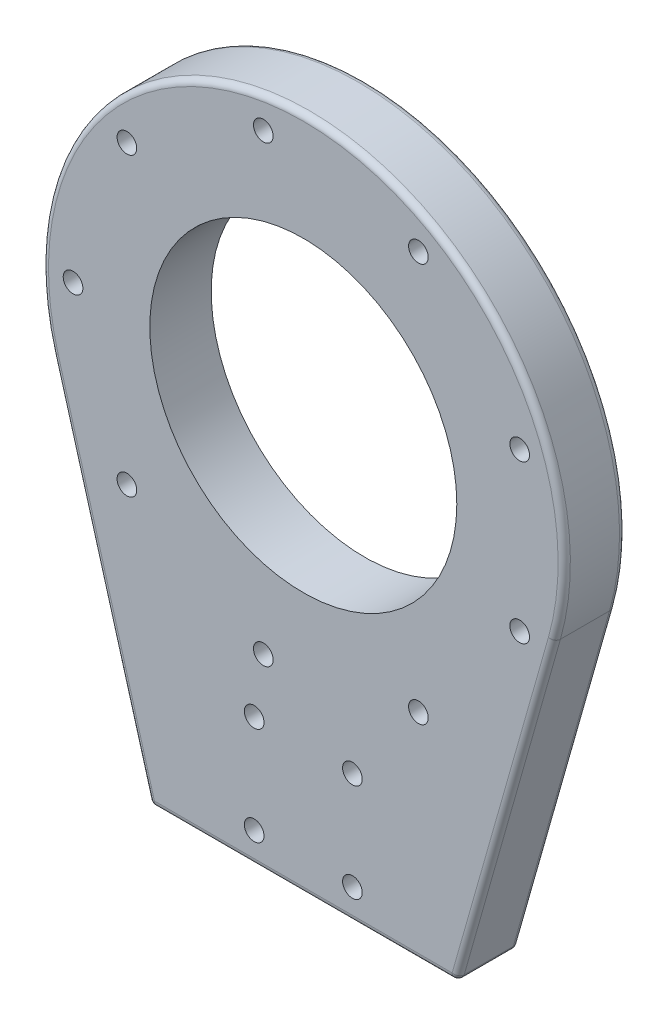
ISO-10303-21;
HEADER;
FILE_DESCRIPTION(('STEP AP214'),'2;1');
FILE_NAME('part.step','',(''),(''),'','','');
FILE_SCHEMA(('AUTOMOTIVE_DESIGN { 1 0 10303 214 1 1 1 1 }'));
ENDSEC;
DATA;
#1=APPLICATION_CONTEXT('core data for automotive mechanical design processes');
#2=APPLICATION_PROTOCOL_DEFINITION('international standard','automotive_design',2000,#1);
#3=PRODUCT_CONTEXT('',#1,'mechanical');
#4=PRODUCT('Part','Part','',(#3));
#5=PRODUCT_RELATED_PRODUCT_CATEGORY('part','',(#4));
#6=PRODUCT_DEFINITION_FORMATION('','',#4);
#7=PRODUCT_DEFINITION_CONTEXT('part definition',#1,'design');
#8=PRODUCT_DEFINITION('design','',#6,#7);
#9=PRODUCT_DEFINITION_SHAPE('','',#8);
#10=(LENGTH_UNIT() NAMED_UNIT(*) SI_UNIT(.MILLI.,.METRE.));
#11=(NAMED_UNIT(*) PLANE_ANGLE_UNIT() SI_UNIT($,.RADIAN.));
#12=(NAMED_UNIT(*) SI_UNIT($,.STERADIAN.) SOLID_ANGLE_UNIT());
#13=UNCERTAINTY_MEASURE_WITH_UNIT(LENGTH_MEASURE(1.E-05),#10,'distance_accuracy_value','');
#14=(GEOMETRIC_REPRESENTATION_CONTEXT(3) GLOBAL_UNCERTAINTY_ASSIGNED_CONTEXT((#13)) GLOBAL_UNIT_ASSIGNED_CONTEXT((#10,
#11,#12)) REPRESENTATION_CONTEXT('',''));
#15=CARTESIAN_POINT('',(0.,0.,0.));
#16=DIRECTION('',(0.,0.,1.));
#17=DIRECTION('',(1.,0.,0.));
#18=AXIS2_PLACEMENT_3D('',#15,#16,#17);
#19=CARTESIAN_POINT('',(0.,0.,10.));
#20=DIRECTION('',(0.,0.,1.));
#21=DIRECTION('',(1.,0.,0.));
#22=AXIS2_PLACEMENT_3D('',#19,#20,#21);
#23=PLANE('',#22);
#24=CARTESIAN_POINT('',(-8.,-46.5,10.));
#25=DIRECTION('',(0.,0.,1.));
#26=DIRECTION('',(1.,0.,0.));
#27=AXIS2_PLACEMENT_3D('',#24,#25,#26);
#28=CIRCLE('',#27,1.6);
#29=CARTESIAN_POINT('',(-6.4,-46.5,10.));
#30=VERTEX_POINT('',#29);
#31=EDGE_CURVE('E663',#30,#30,#28,.T.);
#32=ORIENTED_EDGE('',*,*,#31,.F.);
#33=EDGE_LOOP('',(#32));
#34=FACE_BOUND('',#33,.T.);
#35=CARTESIAN_POINT('',(8.,-62.5,10.));
#36=DIRECTION('',(0.,0.,1.));
#37=DIRECTION('',(1.,0.,0.));
#38=AXIS2_PLACEMENT_3D('',#35,#36,#37);
#39=CIRCLE('',#38,1.6);
#40=CARTESIAN_POINT('',(9.6,-62.5,10.));
#41=VERTEX_POINT('',#40);
#42=EDGE_CURVE('E671',#41,#41,#39,.T.);
#43=ORIENTED_EDGE('',*,*,#42,.F.);
#44=EDGE_LOOP('',(#43));
#45=FACE_BOUND('',#44,.T.);
#46=CARTESIAN_POINT('',(-8.,-62.5,10.));
#47=DIRECTION('',(0.,0.,1.));
#48=DIRECTION('',(1.,0.,0.));
#49=AXIS2_PLACEMENT_3D('',#46,#47,#48);
#50=CIRCLE('',#49,1.6);
#51=CARTESIAN_POINT('',(-6.4,-62.5,10.));
#52=VERTEX_POINT('',#51);
#53=EDGE_CURVE('E672',#52,#52,#50,.T.);
#54=ORIENTED_EDGE('',*,*,#53,.F.);
#55=EDGE_LOOP('',(#54));
#56=FACE_BOUND('',#55,.T.);
#57=CARTESIAN_POINT('',(8.,-46.5,10.));
#58=DIRECTION('',(0.,0.,1.));
#59=DIRECTION('',(1.,0.,0.));
#60=AXIS2_PLACEMENT_3D('',#57,#58,#59);
#61=CIRCLE('',#60,1.6);
#62=CARTESIAN_POINT('',(9.6,-46.5,10.));
#63=VERTEX_POINT('',#62);
#64=EDGE_CURVE('E659',#63,#63,#61,.T.);
#65=ORIENTED_EDGE('',*,*,#64,.F.);
#66=EDGE_LOOP('',(#65));
#67=FACE_BOUND('',#66,.T.);
#68=CARTESIAN_POINT('',(-6.51180666250987,-36.9302907379578,10.));
#69=DIRECTION('',(0.,0.,1.));
#70=DIRECTION('',(1.,0.,0.));
#71=AXIS2_PLACEMENT_3D('',#68,#69,#70);
#72=CIRCLE('',#71,1.6);
#73=CARTESIAN_POINT('',(-4.91180666250987,-36.9302907379578,10.));
#74=VERTEX_POINT('',#73);
#75=EDGE_CURVE('E567',#74,#74,#72,.T.);
#76=ORIENTED_EDGE('',*,*,#75,.F.);
#77=EDGE_LOOP('',(#76));
#78=FACE_BOUND('',#77,.T.);
#79=CARTESIAN_POINT('',(35.2384732794716,-12.8257553747126,10.));
#80=DIRECTION('',(0.,0.,1.));
#81=DIRECTION('',(1.,0.,0.));
#82=AXIS2_PLACEMENT_3D('',#79,#80,#81);
#83=CIRCLE('',#82,1.6);
#84=CARTESIAN_POINT('',(36.8384732794716,-12.8257553747126,10.));
#85=VERTEX_POINT('',#84);
#86=EDGE_CURVE('E583',#85,#85,#83,.T.);
#87=ORIENTED_EDGE('',*,*,#86,.F.);
#88=EDGE_LOOP('',(#87));
#89=FACE_BOUND('',#88,.T.);
#90=CARTESIAN_POINT('',(18.75,32.4759526419165,10.));
#91=DIRECTION('',(0.,0.,1.));
#92=DIRECTION('',(1.,0.,0.));
#93=AXIS2_PLACEMENT_3D('',#90,#91,#92);
#94=CIRCLE('',#93,1.6);
#95=CARTESIAN_POINT('',(20.35,32.4759526419165,10.));
#96=VERTEX_POINT('',#95);
#97=EDGE_CURVE('E599',#96,#96,#94,.T.);
#98=ORIENTED_EDGE('',*,*,#97,.F.);
#99=EDGE_LOOP('',(#98));
#100=FACE_BOUND('',#99,.T.);
#101=CARTESIAN_POINT('',(-28.7266666169617,24.1045353632452,10.));
#102=DIRECTION('',(0.,0.,1.));
#103=DIRECTION('',(1.,0.,0.));
#104=AXIS2_PLACEMENT_3D('',#101,#102,#103);
#105=CIRCLE('',#104,1.6);
#106=CARTESIAN_POINT('',(-27.1266666169617,24.1045353632452,10.));
#107=VERTEX_POINT('',#106);
#108=EDGE_CURVE('E515',#107,#107,#105,.T.);
#109=ORIENTED_EDGE('',*,*,#108,.F.);
#110=EDGE_LOOP('',(#109));
#111=FACE_BOUND('',#110,.T.);
#112=CARTESIAN_POINT('',(-37.5,0.,10.));
#113=DIRECTION('',(0.,0.,1.));
#114=DIRECTION('',(1.,0.,0.));
#115=AXIS2_PLACEMENT_3D('',#112,#113,#114);
#116=CIRCLE('',#115,1.6);
#117=CARTESIAN_POINT('',(-35.9,0.,10.));
#118=VERTEX_POINT('',#117);
#119=EDGE_CURVE('E526',#118,#118,#116,.T.);
#120=ORIENTED_EDGE('',*,*,#119,.F.);
#121=EDGE_LOOP('',(#120));
#122=FACE_BOUND('',#121,.T.);
#123=DIRECTION('',(0.273366705943974,-0.961909893951269,0.));
#124=VECTOR('',#123,1.);
#125=CARTESIAN_POINT('',(-24.0380901060487,-67.226633294056,10.));
#126=LINE('',#125,#124);
#127=CARTESIAN_POINT('',(-39.9192605989776,-11.3447182966749,10.));
#128=VERTEX_POINT('',#127);
#129=CARTESIAN_POINT('',(-24.2445931800626,-66.5,10.));
#130=VERTEX_POINT('',#129);
#131=EDGE_CURVE('E548',#128,#130,#126,.T.);
#132=ORIENTED_EDGE('',*,*,#131,.T.);
#133=DIRECTION('',(1.,0.,0.));
#134=VECTOR('',#133,1.);
#135=CARTESIAN_POINT('',(23.9604015861691,-66.5,10.));
#136=LINE('',#135,#134);
#137=CARTESIAN_POINT('',(24.2445931800626,-66.5,10.));
#138=VERTEX_POINT('',#137);
#139=EDGE_CURVE('E197',#130,#138,#136,.T.);
#140=ORIENTED_EDGE('',*,*,#139,.T.);
#141=DIRECTION('',(0.273366705943974,0.961909893951269,0.));
#142=VECTOR('',#141,1.);
#143=CARTESIAN_POINT('',(39.9192605989776,-11.344718296675,10.));
#144=LINE('',#143,#142);
#145=CARTESIAN_POINT('',(39.9192605989776,-11.344718296675,10.));
#146=VERTEX_POINT('',#145);
#147=EDGE_CURVE('E543',#138,#146,#144,.T.);
#148=ORIENTED_EDGE('',*,*,#147,.T.);
#149=CARTESIAN_POINT('',(0.,0.,10.));
#150=DIRECTION('',(0.,0.,1.));
#151=DIRECTION('',(1.,0.,0.));
#152=AXIS2_PLACEMENT_3D('',#149,#150,#151);
#153=CIRCLE('',#152,41.5);
#154=EDGE_CURVE('E163',#146,#128,#153,.T.);
#155=ORIENTED_EDGE('',*,*,#154,.T.);
#156=EDGE_LOOP('',(#132,#140,#148,#155));
#157=FACE_BOUND('',#156,.T.);
#158=CARTESIAN_POINT('',(0.,0.,10.));
#159=DIRECTION('',(0.,0.,1.));
#160=DIRECTION('',(1.,0.,0.));
#161=AXIS2_PLACEMENT_3D('',#158,#159,#160);
#162=CIRCLE('',#161,25.);
#163=CARTESIAN_POINT('',(25.,0.,10.));
#164=VERTEX_POINT('',#163);
#165=EDGE_CURVE('E509',#164,#164,#162,.T.);
#166=ORIENTED_EDGE('',*,*,#165,.F.);
#167=EDGE_LOOP('',(#166));
#168=FACE_BOUND('',#167,.T.);
#169=CARTESIAN_POINT('',(-6.51180666250989,36.9302907379578,10.));
#170=DIRECTION('',(0.,0.,1.));
#171=DIRECTION('',(1.,0.,0.));
#172=AXIS2_PLACEMENT_3D('',#169,#170,#171);
#173=CIRCLE('',#172,1.59999999999999);
#174=CARTESIAN_POINT('',(-4.9118066625099,36.9302907379578,10.));
#175=VERTEX_POINT('',#174);
#176=EDGE_CURVE('E607',#175,#175,#173,.T.);
#177=ORIENTED_EDGE('',*,*,#176,.F.);
#178=EDGE_LOOP('',(#177));
#179=FACE_BOUND('',#178,.T.);
#180=CARTESIAN_POINT('',(35.2384732794716,12.8257553747126,10.));
#181=DIRECTION('',(0.,0.,1.));
#182=DIRECTION('',(1.,0.,0.));
#183=AXIS2_PLACEMENT_3D('',#180,#181,#182);
#184=CIRCLE('',#183,1.6);
#185=CARTESIAN_POINT('',(36.8384732794716,12.8257553747126,10.));
#186=VERTEX_POINT('',#185);
#187=EDGE_CURVE('E591',#186,#186,#184,.T.);
#188=ORIENTED_EDGE('',*,*,#187,.F.);
#189=EDGE_LOOP('',(#188));
#190=FACE_BOUND('',#189,.T.);
#191=CARTESIAN_POINT('',(18.75,-32.4759526419164,10.));
#192=DIRECTION('',(0.,0.,1.));
#193=DIRECTION('',(1.,0.,0.));
#194=AXIS2_PLACEMENT_3D('',#191,#192,#193);
#195=CIRCLE('',#194,1.6);
#196=CARTESIAN_POINT('',(20.35,-32.4759526419164,10.));
#197=VERTEX_POINT('',#196);
#198=EDGE_CURVE('E575',#197,#197,#195,.T.);
#199=ORIENTED_EDGE('',*,*,#198,.F.);
#200=EDGE_LOOP('',(#199));
#201=FACE_BOUND('',#200,.T.);
#202=CARTESIAN_POINT('',(-28.7266666169617,-24.1045353632452,10.));
#203=DIRECTION('',(0.,0.,1.));
#204=DIRECTION('',(1.,0.,0.));
#205=AXIS2_PLACEMENT_3D('',#202,#203,#204);
#206=CIRCLE('',#205,1.6);
#207=CARTESIAN_POINT('',(-27.1266666169617,-24.1045353632452,10.));
#208=VERTEX_POINT('',#207);
#209=EDGE_CURVE('E557',#208,#208,#206,.T.);
#210=ORIENTED_EDGE('',*,*,#209,.F.);
#211=EDGE_LOOP('',(#210));
#212=FACE_BOUND('',#211,.T.);
#213=ADVANCED_FACE('F49',(#34,#45,#56,#67,#78,#89,#100,#111,#122,#157,#168,#179,#190,#201,#212),
#23,.T.);
#214=CARTESIAN_POINT('',(0.,0.,0.));
#215=DIRECTION('',(0.,0.,1.));
#216=DIRECTION('',(1.,0.,0.));
#217=AXIS2_PLACEMENT_3D('',#214,#215,#216);
#218=PLANE('',#217);
#219=CARTESIAN_POINT('',(-8.,-46.5,0.));
#220=DIRECTION('',(0.,0.,1.));
#221=DIRECTION('',(1.,0.,0.));
#222=AXIS2_PLACEMENT_3D('',#219,#220,#221);
#223=CIRCLE('',#222,1.6);
#224=CARTESIAN_POINT('',(-6.4,-46.5,0.));
#225=VERTEX_POINT('',#224);
#226=EDGE_CURVE('E676',#225,#225,#223,.T.);
#227=ORIENTED_EDGE('',*,*,#226,.T.);
#228=EDGE_LOOP('',(#227));
#229=FACE_BOUND('',#228,.T.);
#230=CARTESIAN_POINT('',(8.,-62.5,0.));
#231=DIRECTION('',(0.,0.,1.));
#232=DIRECTION('',(1.,0.,0.));
#233=AXIS2_PLACEMENT_3D('',#230,#231,#232);
#234=CIRCLE('',#233,1.6);
#235=CARTESIAN_POINT('',(9.6,-62.5,0.));
#236=VERTEX_POINT('',#235);
#237=EDGE_CURVE('E667',#236,#236,#234,.T.);
#238=ORIENTED_EDGE('',*,*,#237,.T.);
#239=EDGE_LOOP('',(#238));
#240=FACE_BOUND('',#239,.T.);
#241=CARTESIAN_POINT('',(-8.,-62.5,0.));
#242=DIRECTION('',(0.,0.,1.));
#243=DIRECTION('',(1.,0.,0.));
#244=AXIS2_PLACEMENT_3D('',#241,#242,#243);
#245=CIRCLE('',#244,1.6);
#246=CARTESIAN_POINT('',(-6.4,-62.5,0.));
#247=VERTEX_POINT('',#246);
#248=EDGE_CURVE('E683',#247,#247,#245,.T.);
#249=ORIENTED_EDGE('',*,*,#248,.T.);
#250=EDGE_LOOP('',(#249));
#251=FACE_BOUND('',#250,.T.);
#252=CARTESIAN_POINT('',(8.,-46.5,0.));
#253=DIRECTION('',(0.,0.,1.));
#254=DIRECTION('',(1.,0.,0.));
#255=AXIS2_PLACEMENT_3D('',#252,#253,#254);
#256=CIRCLE('',#255,1.6);
#257=CARTESIAN_POINT('',(9.6,-46.5,0.));
#258=VERTEX_POINT('',#257);
#259=EDGE_CURVE('E210',#258,#258,#256,.T.);
#260=ORIENTED_EDGE('',*,*,#259,.T.);
#261=EDGE_LOOP('',(#260));
#262=FACE_BOUND('',#261,.T.);
#263=DIRECTION('',(0.273366705943974,0.961909893951269,0.));
#264=VECTOR('',#263,1.);
#265=CARTESIAN_POINT('',(39.9192605989776,-11.3447182966749,0.));
#266=LINE('',#265,#264);
#267=CARTESIAN_POINT('',(39.9192605989776,-11.344718296675,0.));
#268=VERTEX_POINT('',#267);
#269=CARTESIAN_POINT('',(24.2445931800626,-66.5,0.));
#270=VERTEX_POINT('',#269);
#271=EDGE_CURVE('E258',#268,#270,#266,.F.);
#272=ORIENTED_EDGE('',*,*,#271,.T.);
#273=DIRECTION('',(1.,0.,0.));
#274=VECTOR('',#273,1.);
#275=CARTESIAN_POINT('',(0.,-66.5,0.));
#276=LINE('',#275,#274);
#277=CARTESIAN_POINT('',(-24.2445931800626,-66.5,0.));
#278=VERTEX_POINT('',#277);
#279=EDGE_CURVE('E11',#270,#278,#276,.F.);
#280=ORIENTED_EDGE('',*,*,#279,.T.);
#281=DIRECTION('',(0.273366705943974,-0.961909893951269,0.));
#282=VECTOR('',#281,1.);
#283=CARTESIAN_POINT('',(-39.9192605989776,-11.3447182966749,0.));
#284=LINE('',#283,#282);
#285=CARTESIAN_POINT('',(-39.9192605989776,-11.3447182966749,0.));
#286=VERTEX_POINT('',#285);
#287=EDGE_CURVE('E256',#278,#286,#284,.F.);
#288=ORIENTED_EDGE('',*,*,#287,.T.);
#289=CARTESIAN_POINT('',(0.,0.,0.));
#290=DIRECTION('',(0.,0.,1.));
#291=DIRECTION('',(1.,0.,0.));
#292=AXIS2_PLACEMENT_3D('',#289,#290,#291);
#293=CIRCLE('',#292,41.5);
#294=EDGE_CURVE('E267',#286,#268,#293,.F.);
#295=ORIENTED_EDGE('',*,*,#294,.T.);
#296=EDGE_LOOP('',(#272,#280,#288,#295));
#297=FACE_BOUND('',#296,.T.);
#298=CARTESIAN_POINT('',(-37.5,0.,0.));
#299=DIRECTION('',(0.,0.,1.));
#300=DIRECTION('',(1.,0.,0.));
#301=AXIS2_PLACEMENT_3D('',#298,#299,#300);
#302=CIRCLE('',#301,1.6);
#303=CARTESIAN_POINT('',(-35.9,0.,0.));
#304=VERTEX_POINT('',#303);
#305=EDGE_CURVE('E519',#304,#304,#302,.T.);
#306=ORIENTED_EDGE('',*,*,#305,.T.);
#307=EDGE_LOOP('',(#306));
#308=FACE_BOUND('',#307,.T.);
#309=CARTESIAN_POINT('',(0.,0.,0.));
#310=DIRECTION('',(0.,0.,1.));
#311=DIRECTION('',(1.,0.,0.));
#312=AXIS2_PLACEMENT_3D('',#309,#310,#311);
#313=CIRCLE('',#312,25.);
#314=CARTESIAN_POINT('',(25.,0.,0.));
#315=VERTEX_POINT('',#314);
#316=EDGE_CURVE('E512',#315,#315,#313,.T.);
#317=ORIENTED_EDGE('',*,*,#316,.T.);
#318=EDGE_LOOP('',(#317));
#319=FACE_BOUND('',#318,.T.);
#320=CARTESIAN_POINT('',(-28.7266666169617,24.1045353632452,0.));
#321=DIRECTION('',(0.,0.,1.));
#322=DIRECTION('',(1.,0.,0.));
#323=AXIS2_PLACEMENT_3D('',#320,#321,#322);
#324=CIRCLE('',#323,1.6);
#325=CARTESIAN_POINT('',(-27.1266666169617,24.1045353632452,0.));
#326=VERTEX_POINT('',#325);
#327=EDGE_CURVE('E522',#326,#326,#324,.T.);
#328=ORIENTED_EDGE('',*,*,#327,.T.);
#329=EDGE_LOOP('',(#328));
#330=FACE_BOUND('',#329,.T.);
#331=CARTESIAN_POINT('',(-6.51180666250989,36.9302907379578,0.));
#332=DIRECTION('',(0.,0.,1.));
#333=DIRECTION('',(1.,0.,0.));
#334=AXIS2_PLACEMENT_3D('',#331,#332,#333);
#335=CIRCLE('',#334,1.59999999999999);
#336=CARTESIAN_POINT('',(-4.9118066625099,36.9302907379578,0.));
#337=VERTEX_POINT('',#336);
#338=EDGE_CURVE('E603',#337,#337,#335,.T.);
#339=ORIENTED_EDGE('',*,*,#338,.T.);
#340=EDGE_LOOP('',(#339));
#341=FACE_BOUND('',#340,.T.);
#342=CARTESIAN_POINT('',(18.75,32.4759526419165,0.));
#343=DIRECTION('',(0.,0.,1.));
#344=DIRECTION('',(1.,0.,0.));
#345=AXIS2_PLACEMENT_3D('',#342,#343,#344);
#346=CIRCLE('',#345,1.6);
#347=CARTESIAN_POINT('',(20.35,32.4759526419165,0.));
#348=VERTEX_POINT('',#347);
#349=EDGE_CURVE('E595',#348,#348,#346,.T.);
#350=ORIENTED_EDGE('',*,*,#349,.T.);
#351=EDGE_LOOP('',(#350));
#352=FACE_BOUND('',#351,.T.);
#353=CARTESIAN_POINT('',(35.2384732794716,12.8257553747126,0.));
#354=DIRECTION('',(0.,0.,1.));
#355=DIRECTION('',(1.,0.,0.));
#356=AXIS2_PLACEMENT_3D('',#353,#354,#355);
#357=CIRCLE('',#356,1.6);
#358=CARTESIAN_POINT('',(36.8384732794716,12.8257553747126,0.));
#359=VERTEX_POINT('',#358);
#360=EDGE_CURVE('E587',#359,#359,#357,.T.);
#361=ORIENTED_EDGE('',*,*,#360,.T.);
#362=EDGE_LOOP('',(#361));
#363=FACE_BOUND('',#362,.T.);
#364=CARTESIAN_POINT('',(35.2384732794716,-12.8257553747126,0.));
#365=DIRECTION('',(0.,0.,1.));
#366=DIRECTION('',(1.,0.,0.));
#367=AXIS2_PLACEMENT_3D('',#364,#365,#366);
#368=CIRCLE('',#367,1.6);
#369=CARTESIAN_POINT('',(36.8384732794716,-12.8257553747126,0.));
#370=VERTEX_POINT('',#369);
#371=EDGE_CURVE('E579',#370,#370,#368,.T.);
#372=ORIENTED_EDGE('',*,*,#371,.T.);
#373=EDGE_LOOP('',(#372));
#374=FACE_BOUND('',#373,.T.);
#375=CARTESIAN_POINT('',(18.75,-32.4759526419164,0.));
#376=DIRECTION('',(0.,0.,1.));
#377=DIRECTION('',(1.,0.,0.));
#378=AXIS2_PLACEMENT_3D('',#375,#376,#377);
#379=CIRCLE('',#378,1.6);
#380=CARTESIAN_POINT('',(20.35,-32.4759526419164,0.));
#381=VERTEX_POINT('',#380);
#382=EDGE_CURVE('E571',#381,#381,#379,.T.);
#383=ORIENTED_EDGE('',*,*,#382,.T.);
#384=EDGE_LOOP('',(#383));
#385=FACE_BOUND('',#384,.T.);
#386=CARTESIAN_POINT('',(-6.51180666250987,-36.9302907379578,0.));
#387=DIRECTION('',(0.,0.,1.));
#388=DIRECTION('',(1.,0.,0.));
#389=AXIS2_PLACEMENT_3D('',#386,#387,#388);
#390=CIRCLE('',#389,1.6);
#391=CARTESIAN_POINT('',(-4.91180666250987,-36.9302907379578,0.));
#392=VERTEX_POINT('',#391);
#393=EDGE_CURVE('E563',#392,#392,#390,.T.);
#394=ORIENTED_EDGE('',*,*,#393,.T.);
#395=EDGE_LOOP('',(#394));
#396=FACE_BOUND('',#395,.T.);
#397=CARTESIAN_POINT('',(-28.7266666169617,-24.1045353632452,0.));
#398=DIRECTION('',(0.,0.,1.));
#399=DIRECTION('',(1.,0.,0.));
#400=AXIS2_PLACEMENT_3D('',#397,#398,#399);
#401=CIRCLE('',#400,1.6);
#402=CARTESIAN_POINT('',(-27.1266666169617,-24.1045353632452,0.));
#403=VERTEX_POINT('',#402);
#404=EDGE_CURVE('E553',#403,#403,#401,.T.);
#405=ORIENTED_EDGE('',*,*,#404,.T.);
#406=EDGE_LOOP('',(#405));
#407=FACE_BOUND('',#406,.T.);
#408=ADVANCED_FACE('F254',(#229,#240,#251,#262,#297,#308,#319,#330,#341,#352,#363,#374,#385,
#396,#407),#218,.F.);
#409=CARTESIAN_POINT('',(-25.,-67.5,10.));
#410=DIRECTION('',(0.,1.,0.));
#411=DIRECTION('',(0.,0.,1.));
#412=AXIS2_PLACEMENT_3D('',#409,#410,#411);
#413=PLANE('',#412);
#414=DIRECTION('',(1.,0.,0.));
#415=VECTOR('',#414,1.);
#416=CARTESIAN_POINT('',(-23.9604015861691,-67.5,9.));
#417=LINE('',#416,#415);
#418=CARTESIAN_POINT('',(24.2445931800626,-67.5,9.));
#419=VERTEX_POINT('',#418);
#420=CARTESIAN_POINT('',(-24.2445931800626,-67.5,9.));
#421=VERTEX_POINT('',#420);
#422=EDGE_CURVE('E184',#419,#421,#417,.F.);
#423=ORIENTED_EDGE('',*,*,#422,.T.);
#424=DIRECTION('',(0.,0.,-1.));
#425=VECTOR('',#424,1.);
#426=CARTESIAN_POINT('',(-24.2445931800626,-67.5,10.));
#427=LINE('',#426,#425);
#428=CARTESIAN_POINT('',(-24.2445931800626,-67.5,0.999999999999999));
#429=VERTEX_POINT('',#428);
#430=EDGE_CURVE('E187',#421,#429,#427,.T.);
#431=ORIENTED_EDGE('',*,*,#430,.T.);
#432=DIRECTION('',(1.,0.,0.));
#433=VECTOR('',#432,1.);
#434=CARTESIAN_POINT('',(-25.,-67.5,0.999999999999999));
#435=LINE('',#434,#433);
#436=CARTESIAN_POINT('',(24.2445931800626,-67.5,0.999999999999999));
#437=VERTEX_POINT('',#436);
#438=EDGE_CURVE('E178',#429,#437,#435,.T.);
#439=ORIENTED_EDGE('',*,*,#438,.T.);
#440=DIRECTION('',(0.,0.,-1.));
#441=VECTOR('',#440,1.);
#442=CARTESIAN_POINT('',(24.2445931800626,-67.5,10.));
#443=LINE('',#442,#441);
#444=EDGE_CURVE('E181',#437,#419,#443,.F.);
#445=ORIENTED_EDGE('',*,*,#444,.T.);
#446=EDGE_LOOP('',(#423,#431,#439,#445));
#447=FACE_BOUND('',#446,.T.);
#448=ADVANCED_FACE('F292',(#447),#413,.F.);
#449=CARTESIAN_POINT('',(25.,-67.5,10.));
#450=DIRECTION('',(-0.961909893951269,0.273366705943974,0.));
#451=DIRECTION('',(-0.273366705943974,-0.961909893951269,0.));
#452=AXIS2_PLACEMENT_3D('',#449,#450,#451);
#453=PLANE('',#452);
#454=DIRECTION('',(0.273366705943974,0.961909893951269,0.));
#455=VECTOR('',#454,1.);
#456=CARTESIAN_POINT('',(25.,-67.5,9.));
#457=LINE('',#456,#455);
#458=CARTESIAN_POINT('',(40.8811704929289,-11.6180850026189,9.));
#459=VERTEX_POINT('',#458);
#460=CARTESIAN_POINT('',(25.2065030740139,-66.773366705944,9.));
#461=VERTEX_POINT('',#460);
#462=EDGE_CURVE('E146',#459,#461,#457,.F.);
#463=ORIENTED_EDGE('',*,*,#462,.T.);
#464=DIRECTION('',(0.,0.,-1.));
#465=VECTOR('',#464,1.);
#466=CARTESIAN_POINT('',(25.2065030740139,-66.773366705944,10.));
#467=LINE('',#466,#465);
#468=CARTESIAN_POINT('',(25.2065030740139,-66.773366705944,0.999999999999999));
#469=VERTEX_POINT('',#468);
#470=EDGE_CURVE('E74',#461,#469,#467,.T.);
#471=ORIENTED_EDGE('',*,*,#470,.T.);
#472=DIRECTION('',(0.273366705943974,0.961909893951269,0.));
#473=VECTOR('',#472,1.);
#474=CARTESIAN_POINT('',(25.,-67.5,0.999999999999999));
#475=LINE('',#474,#473);
#476=CARTESIAN_POINT('',(40.8811704929289,-11.6180850026189,0.999999999999999));
#477=VERTEX_POINT('',#476);
#478=EDGE_CURVE('E148',#469,#477,#475,.T.);
#479=ORIENTED_EDGE('',*,*,#478,.T.);
#480=DIRECTION('',(0.,0.,-1.));
#481=VECTOR('',#480,1.);
#482=CARTESIAN_POINT('',(40.8811704929289,-11.6180850026189,10.));
#483=LINE('',#482,#481);
#484=EDGE_CURVE('E133',#459,#477,#483,.T.);
#485=ORIENTED_EDGE('',*,*,#484,.F.);
#486=EDGE_LOOP('',(#463,#471,#479,#485));
#487=FACE_BOUND('',#486,.T.);
#488=ADVANCED_FACE('F145',(#487),#453,.F.);
#489=CARTESIAN_POINT('',(0.,0.,10.));
#490=DIRECTION('',(0.,0.,-1.));
#491=DIRECTION('',(-1.,0.,0.));
#492=AXIS2_PLACEMENT_3D('',#489,#490,#491);
#493=CYLINDRICAL_SURFACE('',#492,42.5);
#494=DIRECTION('',(0.,0.,-1.));
#495=VECTOR('',#494,1.);
#496=CARTESIAN_POINT('',(-40.8811704929289,-11.6180850026189,10.));
#497=LINE('',#496,#495);
#498=CARTESIAN_POINT('',(-40.8811704929289,-11.6180850026189,9.));
#499=VERTEX_POINT('',#498);
#500=CARTESIAN_POINT('',(-40.8811704929289,-11.6180850026189,0.999999999999999));
#501=VERTEX_POINT('',#500);
#502=EDGE_CURVE('E135',#499,#501,#497,.T.);
#503=ORIENTED_EDGE('',*,*,#502,.F.);
#504=CARTESIAN_POINT('',(0.,0.,9.));
#505=DIRECTION('',(0.,0.,1.));
#506=DIRECTION('',(1.,0.,0.));
#507=AXIS2_PLACEMENT_3D('',#504,#505,#506);
#508=CIRCLE('',#507,42.5);
#509=EDGE_CURVE('E130',#499,#459,#508,.F.);
#510=ORIENTED_EDGE('',*,*,#509,.T.);
#511=ORIENTED_EDGE('',*,*,#484,.T.);
#512=CARTESIAN_POINT('',(0.,0.,0.999999999999999));
#513=DIRECTION('',(0.,0.,1.));
#514=DIRECTION('',(1.,0.,0.));
#515=AXIS2_PLACEMENT_3D('',#512,#513,#514);
#516=CIRCLE('',#515,42.5);
#517=EDGE_CURVE('E142',#477,#501,#516,.T.);
#518=ORIENTED_EDGE('',*,*,#517,.T.);
#519=EDGE_LOOP('',(#503,#510,#511,#518));
#520=FACE_BOUND('',#519,.T.);
#521=ADVANCED_FACE('F132',(#520),#493,.T.);
#522=CARTESIAN_POINT('',(-40.8811704929289,-11.6180850026189,10.));
#523=DIRECTION('',(0.961909893951269,0.273366705943974,0.));
#524=DIRECTION('',(-0.273366705943974,0.961909893951269,0.));
#525=AXIS2_PLACEMENT_3D('',#522,#523,#524);
#526=PLANE('',#525);
#527=DIRECTION('',(0.273366705943974,-0.961909893951269,0.));
#528=VECTOR('',#527,1.);
#529=CARTESIAN_POINT('',(-40.8811704929289,-11.6180850026189,0.999999999999999));
#530=LINE('',#529,#528);
#531=CARTESIAN_POINT('',(-25.2065030740139,-66.773366705944,0.999999999999999));
#532=VERTEX_POINT('',#531);
#533=EDGE_CURVE('E281',#501,#532,#530,.T.);
#534=ORIENTED_EDGE('',*,*,#533,.T.);
#535=DIRECTION('',(0.,0.,-1.));
#536=VECTOR('',#535,1.);
#537=CARTESIAN_POINT('',(-25.2065030740139,-66.773366705944,10.));
#538=LINE('',#537,#536);
#539=CARTESIAN_POINT('',(-25.2065030740139,-66.773366705944,9.));
#540=VERTEX_POINT('',#539);
#541=EDGE_CURVE('E191',#532,#540,#538,.F.);
#542=ORIENTED_EDGE('',*,*,#541,.T.);
#543=DIRECTION('',(0.273366705943974,-0.961909893951269,0.));
#544=VECTOR('',#543,1.);
#545=CARTESIAN_POINT('',(-40.8811704929289,-11.6180850026189,9.));
#546=LINE('',#545,#544);
#547=EDGE_CURVE('E280',#540,#499,#546,.F.);
#548=ORIENTED_EDGE('',*,*,#547,.T.);
#549=ORIENTED_EDGE('',*,*,#502,.T.);
#550=EDGE_LOOP('',(#534,#542,#548,#549));
#551=FACE_BOUND('',#550,.T.);
#552=ADVANCED_FACE('F279',(#551),#526,.F.);
#553=CARTESIAN_POINT('',(-37.5,0.,10.));
#554=DIRECTION('',(0.,0.,-1.));
#555=DIRECTION('',(-1.,0.,0.));
#556=AXIS2_PLACEMENT_3D('',#553,#554,#555);
#557=CYLINDRICAL_SURFACE('',#556,1.6);
#558=ORIENTED_EDGE('',*,*,#119,.T.);
#559=EDGE_LOOP('',(#558));
#560=FACE_BOUND('',#559,.T.);
#561=ORIENTED_EDGE('',*,*,#305,.F.);
#562=EDGE_LOOP('',(#561));
#563=FACE_BOUND('',#562,.T.);
#564=ADVANCED_FACE('F311',(#560,#563),#557,.F.);
#565=CARTESIAN_POINT('',(0.,0.,10.));
#566=DIRECTION('',(0.,0.,-1.));
#567=DIRECTION('',(-1.,0.,0.));
#568=AXIS2_PLACEMENT_3D('',#565,#566,#567);
#569=CYLINDRICAL_SURFACE('',#568,25.);
#570=ORIENTED_EDGE('',*,*,#165,.T.);
#571=EDGE_LOOP('',(#570));
#572=FACE_BOUND('',#571,.T.);
#573=ORIENTED_EDGE('',*,*,#316,.F.);
#574=EDGE_LOOP('',(#573));
#575=FACE_BOUND('',#574,.T.);
#576=ADVANCED_FACE('F498',(#572,#575),#569,.F.);
#577=CARTESIAN_POINT('',(-28.7266666169617,24.1045353632452,10.));
#578=DIRECTION('',(0.,0.,-1.));
#579=DIRECTION('',(-1.,0.,0.));
#580=AXIS2_PLACEMENT_3D('',#577,#578,#579);
#581=CYLINDRICAL_SURFACE('',#580,1.6);
#582=ORIENTED_EDGE('',*,*,#108,.T.);
#583=EDGE_LOOP('',(#582));
#584=FACE_BOUND('',#583,.T.);
#585=ORIENTED_EDGE('',*,*,#327,.F.);
#586=EDGE_LOOP('',(#585));
#587=FACE_BOUND('',#586,.T.);
#588=ADVANCED_FACE('F495',(#584,#587),#581,.F.);
#589=CARTESIAN_POINT('',(-6.51180666250989,36.9302907379578,10.));
#590=DIRECTION('',(0.,0.,-1.));
#591=DIRECTION('',(-1.,0.,0.));
#592=AXIS2_PLACEMENT_3D('',#589,#590,#591);
#593=CYLINDRICAL_SURFACE('',#592,1.59999999999999);
#594=ORIENTED_EDGE('',*,*,#176,.T.);
#595=EDGE_LOOP('',(#594));
#596=FACE_BOUND('',#595,.T.);
#597=ORIENTED_EDGE('',*,*,#338,.F.);
#598=EDGE_LOOP('',(#597));
#599=FACE_BOUND('',#598,.T.);
#600=ADVANCED_FACE('F491',(#596,#599),#593,.F.);
#601=CARTESIAN_POINT('',(18.75,32.4759526419165,10.));
#602=DIRECTION('',(0.,0.,-1.));
#603=DIRECTION('',(-1.,0.,0.));
#604=AXIS2_PLACEMENT_3D('',#601,#602,#603);
#605=CYLINDRICAL_SURFACE('',#604,1.6);
#606=ORIENTED_EDGE('',*,*,#97,.T.);
#607=EDGE_LOOP('',(#606));
#608=FACE_BOUND('',#607,.T.);
#609=ORIENTED_EDGE('',*,*,#349,.F.);
#610=EDGE_LOOP('',(#609));
#611=FACE_BOUND('',#610,.T.);
#612=ADVANCED_FACE('F487',(#608,#611),#605,.F.);
#613=CARTESIAN_POINT('',(35.2384732794716,12.8257553747126,10.));
#614=DIRECTION('',(0.,0.,-1.));
#615=DIRECTION('',(-1.,0.,0.));
#616=AXIS2_PLACEMENT_3D('',#613,#614,#615);
#617=CYLINDRICAL_SURFACE('',#616,1.6);
#618=ORIENTED_EDGE('',*,*,#187,.T.);
#619=EDGE_LOOP('',(#618));
#620=FACE_BOUND('',#619,.T.);
#621=ORIENTED_EDGE('',*,*,#360,.F.);
#622=EDGE_LOOP('',(#621));
#623=FACE_BOUND('',#622,.T.);
#624=ADVANCED_FACE('F483',(#620,#623),#617,.F.);
#625=CARTESIAN_POINT('',(35.2384732794716,-12.8257553747126,10.));
#626=DIRECTION('',(0.,0.,-1.));
#627=DIRECTION('',(-1.,0.,0.));
#628=AXIS2_PLACEMENT_3D('',#625,#626,#627);
#629=CYLINDRICAL_SURFACE('',#628,1.6);
#630=ORIENTED_EDGE('',*,*,#86,.T.);
#631=EDGE_LOOP('',(#630));
#632=FACE_BOUND('',#631,.T.);
#633=ORIENTED_EDGE('',*,*,#371,.F.);
#634=EDGE_LOOP('',(#633));
#635=FACE_BOUND('',#634,.T.);
#636=ADVANCED_FACE('F479',(#632,#635),#629,.F.);
#637=CARTESIAN_POINT('',(18.75,-32.4759526419164,10.));
#638=DIRECTION('',(0.,0.,-1.));
#639=DIRECTION('',(-1.,0.,0.));
#640=AXIS2_PLACEMENT_3D('',#637,#638,#639);
#641=CYLINDRICAL_SURFACE('',#640,1.6);
#642=ORIENTED_EDGE('',*,*,#198,.T.);
#643=EDGE_LOOP('',(#642));
#644=FACE_BOUND('',#643,.T.);
#645=ORIENTED_EDGE('',*,*,#382,.F.);
#646=EDGE_LOOP('',(#645));
#647=FACE_BOUND('',#646,.T.);
#648=ADVANCED_FACE('F475',(#644,#647),#641,.F.);
#649=CARTESIAN_POINT('',(-6.51180666250987,-36.9302907379578,10.));
#650=DIRECTION('',(0.,0.,-1.));
#651=DIRECTION('',(-1.,0.,0.));
#652=AXIS2_PLACEMENT_3D('',#649,#650,#651);
#653=CYLINDRICAL_SURFACE('',#652,1.6);
#654=ORIENTED_EDGE('',*,*,#75,.T.);
#655=EDGE_LOOP('',(#654));
#656=FACE_BOUND('',#655,.T.);
#657=ORIENTED_EDGE('',*,*,#393,.F.);
#658=EDGE_LOOP('',(#657));
#659=FACE_BOUND('',#658,.T.);
#660=ADVANCED_FACE('F472',(#656,#659),#653,.F.);
#661=CARTESIAN_POINT('',(-28.7266666169617,-24.1045353632452,10.));
#662=DIRECTION('',(0.,0.,-1.));
#663=DIRECTION('',(-1.,0.,0.));
#664=AXIS2_PLACEMENT_3D('',#661,#662,#663);
#665=CYLINDRICAL_SURFACE('',#664,1.6);
#666=ORIENTED_EDGE('',*,*,#209,.T.);
#667=EDGE_LOOP('',(#666));
#668=FACE_BOUND('',#667,.T.);
#669=ORIENTED_EDGE('',*,*,#404,.F.);
#670=EDGE_LOOP('',(#669));
#671=FACE_BOUND('',#670,.T.);
#672=ADVANCED_FACE('F326',(#668,#671),#665,.F.);
#673=CARTESIAN_POINT('',(-39.9192605989776,-11.3447182966749,0.999999999999999));
#674=DIRECTION('',(0.273366705943974,-0.961909893951269,0.));
#675=DIRECTION('',(0.961909893951269,0.273366705943974,0.));
#676=AXIS2_PLACEMENT_3D('',#673,#674,#675);
#677=CYLINDRICAL_SURFACE('',#676,1.);
#678=ORIENTED_EDGE('',*,*,#287,.F.);
#679=CARTESIAN_POINT('',(-24.2445931800626,-66.5,0.999999999999999));
#680=DIRECTION('',(0.273366705943974,-0.961909893951269,0.));
#681=DIRECTION('',(0.961909893951269,0.273366705943974,0.));
#682=AXIS2_PLACEMENT_3D('',#679,#680,#681);
#683=CIRCLE('',#682,1.);
#684=EDGE_CURVE('E141',#278,#532,#683,.F.);
#685=ORIENTED_EDGE('',*,*,#684,.T.);
#686=ORIENTED_EDGE('',*,*,#533,.F.);
#687=CARTESIAN_POINT('',(-39.9192605989776,-11.3447182966749,1.));
#688=DIRECTION('',(-0.273366705943973,0.961909893951269,0.));
#689=DIRECTION('',(-0.961909893951269,-0.273366705943973,0.));
#690=AXIS2_PLACEMENT_3D('',#687,#688,#689);
#691=CIRCLE('',#690,1.);
#692=EDGE_CURVE('E170',#286,#501,#691,.T.);
#693=ORIENTED_EDGE('',*,*,#692,.F.);
#694=EDGE_LOOP('',(#678,#685,#686,#693));
#695=FACE_BOUND('',#694,.T.);
#696=ADVANCED_FACE('F261',(#695),#677,.T.);
#697=CARTESIAN_POINT('',(0.,0.,0.999999999999999));
#698=DIRECTION('',(0.,0.,1.));
#699=DIRECTION('',(1.,0.,0.));
#700=AXIS2_PLACEMENT_3D('',#697,#698,#699);
#701=TOROIDAL_SURFACE('',#700,41.5,1.);
#702=ORIENTED_EDGE('',*,*,#692,.T.);
#703=ORIENTED_EDGE('',*,*,#517,.F.);
#704=CARTESIAN_POINT('',(39.9192605989776,-11.344718296675,1.));
#705=DIRECTION('',(-0.273366705943973,-0.961909893951269,0.));
#706=DIRECTION('',(0.961909893951269,-0.273366705943973,0.));
#707=AXIS2_PLACEMENT_3D('',#704,#705,#706);
#708=CIRCLE('',#707,1.);
#709=EDGE_CURVE('E165',#268,#477,#708,.T.);
#710=ORIENTED_EDGE('',*,*,#709,.F.);
#711=ORIENTED_EDGE('',*,*,#294,.F.);
#712=EDGE_LOOP('',(#702,#703,#710,#711));
#713=FACE_BOUND('',#712,.T.);
#714=ADVANCED_FACE('F330',(#713),#701,.T.);
#715=CARTESIAN_POINT('',(24.0380901060487,-67.226633294056,0.999999999999999));
#716=DIRECTION('',(0.273366705943974,0.961909893951269,0.));
#717=DIRECTION('',(-0.961909893951269,0.273366705943974,0.));
#718=AXIS2_PLACEMENT_3D('',#715,#716,#717);
#719=CYLINDRICAL_SURFACE('',#718,1.);
#720=ORIENTED_EDGE('',*,*,#478,.F.);
#721=CARTESIAN_POINT('',(24.2445931800626,-66.5,0.999999999999999));
#722=DIRECTION('',(0.273366705943974,0.961909893951269,0.));
#723=DIRECTION('',(-0.961909893951269,0.273366705943974,0.));
#724=AXIS2_PLACEMENT_3D('',#721,#722,#723);
#725=CIRCLE('',#724,1.);
#726=EDGE_CURVE('E59',#469,#270,#725,.T.);
#727=ORIENTED_EDGE('',*,*,#726,.T.);
#728=ORIENTED_EDGE('',*,*,#271,.F.);
#729=ORIENTED_EDGE('',*,*,#709,.T.);
#730=EDGE_LOOP('',(#720,#727,#728,#729));
#731=FACE_BOUND('',#730,.T.);
#732=ADVANCED_FACE('F333',(#731),#719,.T.);
#733=CARTESIAN_POINT('',(39.9192605989776,-11.3447182966749,9.));
#734=DIRECTION('',(-0.273366705943974,-0.961909893951269,0.));
#735=DIRECTION('',(0.961909893951269,-0.273366705943974,0.));
#736=AXIS2_PLACEMENT_3D('',#733,#734,#735);
#737=CYLINDRICAL_SURFACE('',#736,1.);
#738=ORIENTED_EDGE('',*,*,#147,.F.);
#739=CARTESIAN_POINT('',(24.2445931800626,-66.5,9.));
#740=DIRECTION('',(-0.273366705943974,-0.961909893951269,0.));
#741=DIRECTION('',(0.961909893951269,-0.273366705943974,0.));
#742=AXIS2_PLACEMENT_3D('',#739,#740,#741);
#743=CIRCLE('',#742,1.);
#744=EDGE_CURVE('E159',#138,#461,#743,.F.);
#745=ORIENTED_EDGE('',*,*,#744,.T.);
#746=ORIENTED_EDGE('',*,*,#462,.F.);
#747=CARTESIAN_POINT('',(39.9192605989776,-11.344718296675,9.));
#748=DIRECTION('',(0.273366705943975,0.961909893951268,0.));
#749=DIRECTION('',(-0.961909893951268,0.273366705943975,0.));
#750=AXIS2_PLACEMENT_3D('',#747,#748,#749);
#751=CIRCLE('',#750,1.);
#752=EDGE_CURVE('E156',#146,#459,#751,.T.);
#753=ORIENTED_EDGE('',*,*,#752,.F.);
#754=EDGE_LOOP('',(#738,#745,#746,#753));
#755=FACE_BOUND('',#754,.T.);
#756=ADVANCED_FACE('F155',(#755),#737,.T.);
#757=CARTESIAN_POINT('',(0.,0.,9.));
#758=DIRECTION('',(0.,0.,1.));
#759=DIRECTION('',(1.,0.,0.));
#760=AXIS2_PLACEMENT_3D('',#757,#758,#759);
#761=TOROIDAL_SURFACE('',#760,41.5,1.);
#762=ORIENTED_EDGE('',*,*,#752,.T.);
#763=ORIENTED_EDGE('',*,*,#509,.F.);
#764=CARTESIAN_POINT('',(-39.9192605989776,-11.3447182966749,9.));
#765=DIRECTION('',(0.273366705943972,-0.961909893951269,0.));
#766=DIRECTION('',(0.961909893951269,0.273366705943972,0.));
#767=AXIS2_PLACEMENT_3D('',#764,#765,#766);
#768=CIRCLE('',#767,1.);
#769=EDGE_CURVE('E166',#128,#499,#768,.T.);
#770=ORIENTED_EDGE('',*,*,#769,.F.);
#771=ORIENTED_EDGE('',*,*,#154,.F.);
#772=EDGE_LOOP('',(#762,#763,#770,#771));
#773=FACE_BOUND('',#772,.T.);
#774=ADVANCED_FACE('F162',(#773),#761,.T.);
#775=CARTESIAN_POINT('',(-39.9192605989776,-11.3447182966749,9.));
#776=DIRECTION('',(-0.273366705943974,0.961909893951269,0.));
#777=DIRECTION('',(-0.961909893951269,-0.273366705943974,0.));
#778=AXIS2_PLACEMENT_3D('',#775,#776,#777);
#779=CYLINDRICAL_SURFACE('',#778,1.);
#780=ORIENTED_EDGE('',*,*,#547,.F.);
#781=CARTESIAN_POINT('',(-24.2445931800626,-66.5,9.));
#782=DIRECTION('',(-0.273366705943974,0.961909893951269,0.));
#783=DIRECTION('',(-0.961909893951269,-0.273366705943974,0.));
#784=AXIS2_PLACEMENT_3D('',#781,#782,#783);
#785=CIRCLE('',#784,1.);
#786=EDGE_CURVE('E194',#540,#130,#785,.T.);
#787=ORIENTED_EDGE('',*,*,#786,.T.);
#788=ORIENTED_EDGE('',*,*,#131,.F.);
#789=ORIENTED_EDGE('',*,*,#769,.T.);
#790=EDGE_LOOP('',(#780,#787,#788,#789));
#791=FACE_BOUND('',#790,.T.);
#792=ADVANCED_FACE('F284',(#791),#779,.T.);
#793=CARTESIAN_POINT('',(24.2445931800626,-66.5,9.));
#794=DIRECTION('',(0.,1.,0.));
#795=DIRECTION('',(0.,0.,1.));
#796=AXIS2_PLACEMENT_3D('',#793,#794,#795);
#797=SPHERICAL_SURFACE('',#796,1.);
#798=CARTESIAN_POINT('',(24.2445931800626,-66.5,9.));
#799=DIRECTION('',(0.,0.,-1.));
#800=DIRECTION('',(-1.,0.,0.));
#801=AXIS2_PLACEMENT_3D('',#798,#799,#800);
#802=CIRCLE('',#801,1.);
#803=EDGE_CURVE('E228',#461,#419,#802,.T.);
#804=ORIENTED_EDGE('',*,*,#803,.F.);
#805=ORIENTED_EDGE('',*,*,#744,.F.);
#806=CARTESIAN_POINT('',(24.2445931800626,-66.5,9.));
#807=DIRECTION('',(-1.,0.,0.));
#808=DIRECTION('',(0.,0.,1.));
#809=AXIS2_PLACEMENT_3D('',#806,#807,#808);
#810=CIRCLE('',#809,1.);
#811=EDGE_CURVE('E53',#419,#138,#810,.T.);
#812=ORIENTED_EDGE('',*,*,#811,.F.);
#813=EDGE_LOOP('',(#804,#805,#812));
#814=FACE_BOUND('',#813,.T.);
#815=ADVANCED_FACE('F51',(#814),#797,.T.);
#816=CARTESIAN_POINT('',(0.,-66.5,9.));
#817=DIRECTION('',(-1.,0.,0.));
#818=DIRECTION('',(0.,0.,1.));
#819=AXIS2_PLACEMENT_3D('',#816,#817,#818);
#820=CYLINDRICAL_SURFACE('',#819,1.);
#821=ORIENTED_EDGE('',*,*,#811,.T.);
#822=ORIENTED_EDGE('',*,*,#139,.F.);
#823=CARTESIAN_POINT('',(-24.2445931800626,-66.5,9.));
#824=DIRECTION('',(-1.,0.,0.));
#825=DIRECTION('',(0.,0.,1.));
#826=AXIS2_PLACEMENT_3D('',#823,#824,#825);
#827=CIRCLE('',#826,1.);
#828=EDGE_CURVE('E225',#421,#130,#827,.T.);
#829=ORIENTED_EDGE('',*,*,#828,.F.);
#830=ORIENTED_EDGE('',*,*,#422,.F.);
#831=EDGE_LOOP('',(#821,#822,#829,#830));
#832=FACE_BOUND('',#831,.T.);
#833=ADVANCED_FACE('F239',(#832),#820,.T.);
#834=CARTESIAN_POINT('',(24.2445931800626,-66.5,10.));
#835=DIRECTION('',(0.,0.,-1.));
#836=DIRECTION('',(-1.,0.,0.));
#837=AXIS2_PLACEMENT_3D('',#834,#835,#836);
#838=CYLINDRICAL_SURFACE('',#837,1.);
#839=ORIENTED_EDGE('',*,*,#803,.T.);
#840=ORIENTED_EDGE('',*,*,#444,.F.);
#841=CARTESIAN_POINT('',(24.2445931800626,-66.5,0.999999999999999));
#842=DIRECTION('',(0.,0.,-1.));
#843=DIRECTION('',(-1.,0.,0.));
#844=AXIS2_PLACEMENT_3D('',#841,#842,#843);
#845=CIRCLE('',#844,1.);
#846=EDGE_CURVE('E221',#469,#437,#845,.T.);
#847=ORIENTED_EDGE('',*,*,#846,.F.);
#848=ORIENTED_EDGE('',*,*,#470,.F.);
#849=EDGE_LOOP('',(#839,#840,#847,#848));
#850=FACE_BOUND('',#849,.T.);
#851=ADVANCED_FACE('F243',(#850),#838,.T.);
#852=CARTESIAN_POINT('',(-24.2445931800626,-66.5,9.));
#853=DIRECTION('',(0.,1.,0.));
#854=DIRECTION('',(0.,0.,1.));
#855=AXIS2_PLACEMENT_3D('',#852,#853,#854);
#856=SPHERICAL_SURFACE('',#855,1.);
#857=ORIENTED_EDGE('',*,*,#828,.T.);
#858=ORIENTED_EDGE('',*,*,#786,.F.);
#859=CARTESIAN_POINT('',(-24.2445931800626,-66.5,9.));
#860=DIRECTION('',(0.,0.,-1.));
#861=DIRECTION('',(-1.,0.,0.));
#862=AXIS2_PLACEMENT_3D('',#859,#860,#861);
#863=CIRCLE('',#862,1.);
#864=EDGE_CURVE('E217',#421,#540,#863,.T.);
#865=ORIENTED_EDGE('',*,*,#864,.F.);
#866=EDGE_LOOP('',(#857,#858,#865));
#867=FACE_BOUND('',#866,.T.);
#868=ADVANCED_FACE('F290',(#867),#856,.T.);
#869=CARTESIAN_POINT('',(24.2445931800626,-66.5,0.999999999999999));
#870=DIRECTION('',(0.,1.,0.));
#871=DIRECTION('',(0.,0.,1.));
#872=AXIS2_PLACEMENT_3D('',#869,#870,#871);
#873=SPHERICAL_SURFACE('',#872,1.);
#874=ORIENTED_EDGE('',*,*,#726,.F.);
#875=ORIENTED_EDGE('',*,*,#846,.T.);
#876=CARTESIAN_POINT('',(24.2445931800626,-66.5,0.999999999999999));
#877=DIRECTION('',(-1.,0.,0.));
#878=DIRECTION('',(0.,0.,1.));
#879=AXIS2_PLACEMENT_3D('',#876,#877,#878);
#880=CIRCLE('',#879,1.);
#881=EDGE_CURVE('E213',#270,#437,#880,.T.);
#882=ORIENTED_EDGE('',*,*,#881,.F.);
#883=EDGE_LOOP('',(#874,#875,#882));
#884=FACE_BOUND('',#883,.T.);
#885=ADVANCED_FACE('F246',(#884),#873,.T.);
#886=CARTESIAN_POINT('',(-24.2445931800626,-66.5,10.));
#887=DIRECTION('',(0.,0.,-1.));
#888=DIRECTION('',(-1.,0.,0.));
#889=AXIS2_PLACEMENT_3D('',#886,#887,#888);
#890=CYLINDRICAL_SURFACE('',#889,1.);
#891=ORIENTED_EDGE('',*,*,#864,.T.);
#892=ORIENTED_EDGE('',*,*,#541,.F.);
#893=CARTESIAN_POINT('',(-24.2445931800626,-66.5,0.999999999999999));
#894=DIRECTION('',(0.,0.,-1.));
#895=DIRECTION('',(-1.,0.,0.));
#896=AXIS2_PLACEMENT_3D('',#893,#894,#895);
#897=CIRCLE('',#896,1.);
#898=EDGE_CURVE('E209',#429,#532,#897,.T.);
#899=ORIENTED_EDGE('',*,*,#898,.F.);
#900=ORIENTED_EDGE('',*,*,#430,.F.);
#901=EDGE_LOOP('',(#891,#892,#899,#900));
#902=FACE_BOUND('',#901,.T.);
#903=ADVANCED_FACE('F275',(#902),#890,.T.);
#904=CARTESIAN_POINT('',(-25.,-66.5,0.999999999999999));
#905=DIRECTION('',(1.,0.,0.));
#906=DIRECTION('',(0.,0.,-1.));
#907=AXIS2_PLACEMENT_3D('',#904,#905,#906);
#908=CYLINDRICAL_SURFACE('',#907,1.);
#909=ORIENTED_EDGE('',*,*,#881,.T.);
#910=ORIENTED_EDGE('',*,*,#438,.F.);
#911=CARTESIAN_POINT('',(-24.2445931800626,-66.5,1.));
#912=DIRECTION('',(-1.,0.,0.));
#913=DIRECTION('',(0.,-1.,0.));
#914=AXIS2_PLACEMENT_3D('',#911,#912,#913);
#915=CIRCLE('',#914,1.);
#916=EDGE_CURVE('E206',#278,#429,#915,.T.);
#917=ORIENTED_EDGE('',*,*,#916,.F.);
#918=ORIENTED_EDGE('',*,*,#279,.F.);
#919=EDGE_LOOP('',(#909,#910,#917,#918));
#920=FACE_BOUND('',#919,.T.);
#921=ADVANCED_FACE('F251',(#920),#908,.T.);
#922=CARTESIAN_POINT('',(-24.2445931800626,-66.5,0.999999999999999));
#923=DIRECTION('',(0.,1.,0.));
#924=DIRECTION('',(0.,0.,1.));
#925=AXIS2_PLACEMENT_3D('',#922,#923,#924);
#926=SPHERICAL_SURFACE('',#925,1.);
#927=ORIENTED_EDGE('',*,*,#898,.T.);
#928=ORIENTED_EDGE('',*,*,#684,.F.);
#929=ORIENTED_EDGE('',*,*,#916,.T.);
#930=EDGE_LOOP('',(#927,#928,#929));
#931=FACE_BOUND('',#930,.T.);
#932=ADVANCED_FACE('F270',(#931),#926,.T.);
#933=CARTESIAN_POINT('',(8.,-46.5,0.));
#934=DIRECTION('',(0.,0.,1.));
#935=DIRECTION('',(1.,0.,0.));
#936=AXIS2_PLACEMENT_3D('',#933,#934,#935);
#937=CYLINDRICAL_SURFACE('',#936,1.6);
#938=ORIENTED_EDGE('',*,*,#259,.F.);
#939=EDGE_LOOP('',(#938));
#940=FACE_BOUND('',#939,.T.);
#941=ORIENTED_EDGE('',*,*,#64,.T.);
#942=EDGE_LOOP('',(#941));
#943=FACE_BOUND('',#942,.T.);
#944=ADVANCED_FACE('F424',(#940,#943),#937,.F.);
#945=CARTESIAN_POINT('',(-8.,-62.5,0.));
#946=DIRECTION('',(0.,0.,1.));
#947=DIRECTION('',(1.,0.,0.));
#948=AXIS2_PLACEMENT_3D('',#945,#946,#947);
#949=CYLINDRICAL_SURFACE('',#948,1.6);
#950=ORIENTED_EDGE('',*,*,#248,.F.);
#951=EDGE_LOOP('',(#950));
#952=FACE_BOUND('',#951,.T.);
#953=ORIENTED_EDGE('',*,*,#53,.T.);
#954=EDGE_LOOP('',(#953));
#955=FACE_BOUND('',#954,.T.);
#956=ADVANCED_FACE('F434',(#952,#955),#949,.F.);
#957=CARTESIAN_POINT('',(8.,-62.5,0.));
#958=DIRECTION('',(0.,0.,1.));
#959=DIRECTION('',(1.,0.,0.));
#960=AXIS2_PLACEMENT_3D('',#957,#958,#959);
#961=CYLINDRICAL_SURFACE('',#960,1.6);
#962=ORIENTED_EDGE('',*,*,#237,.F.);
#963=EDGE_LOOP('',(#962));
#964=FACE_BOUND('',#963,.T.);
#965=ORIENTED_EDGE('',*,*,#42,.T.);
#966=EDGE_LOOP('',(#965));
#967=FACE_BOUND('',#966,.T.);
#968=ADVANCED_FACE('F445',(#964,#967),#961,.F.);
#969=CARTESIAN_POINT('',(-8.,-46.5,0.));
#970=DIRECTION('',(0.,0.,1.));
#971=DIRECTION('',(1.,0.,0.));
#972=AXIS2_PLACEMENT_3D('',#969,#970,#971);
#973=CYLINDRICAL_SURFACE('',#972,1.6);
#974=ORIENTED_EDGE('',*,*,#226,.F.);
#975=EDGE_LOOP('',(#974));
#976=FACE_BOUND('',#975,.T.);
#977=ORIENTED_EDGE('',*,*,#31,.T.);
#978=EDGE_LOOP('',(#977));
#979=FACE_BOUND('',#978,.T.);
#980=ADVANCED_FACE('F455',(#976,#979),#973,.F.);
#981=CLOSED_SHELL('',(#213,#408,#448,#488,#521,#552,#564,#576,#588,#600,#612,#624,#636,#648,
#660,#672,#696,#714,#732,#756,#774,#792,#815,#833,#851,#868,#885,#903,#921,#932,#944,#956,#968,#980));
#982=MANIFOLD_SOLID_BREP('B2',#981);
#983=ADVANCED_BREP_SHAPE_REPRESENTATION('',(#18,#982),#14);
#984=SHAPE_DEFINITION_REPRESENTATION(#9,#983);
ENDSEC;
END-ISO-10303-21;
